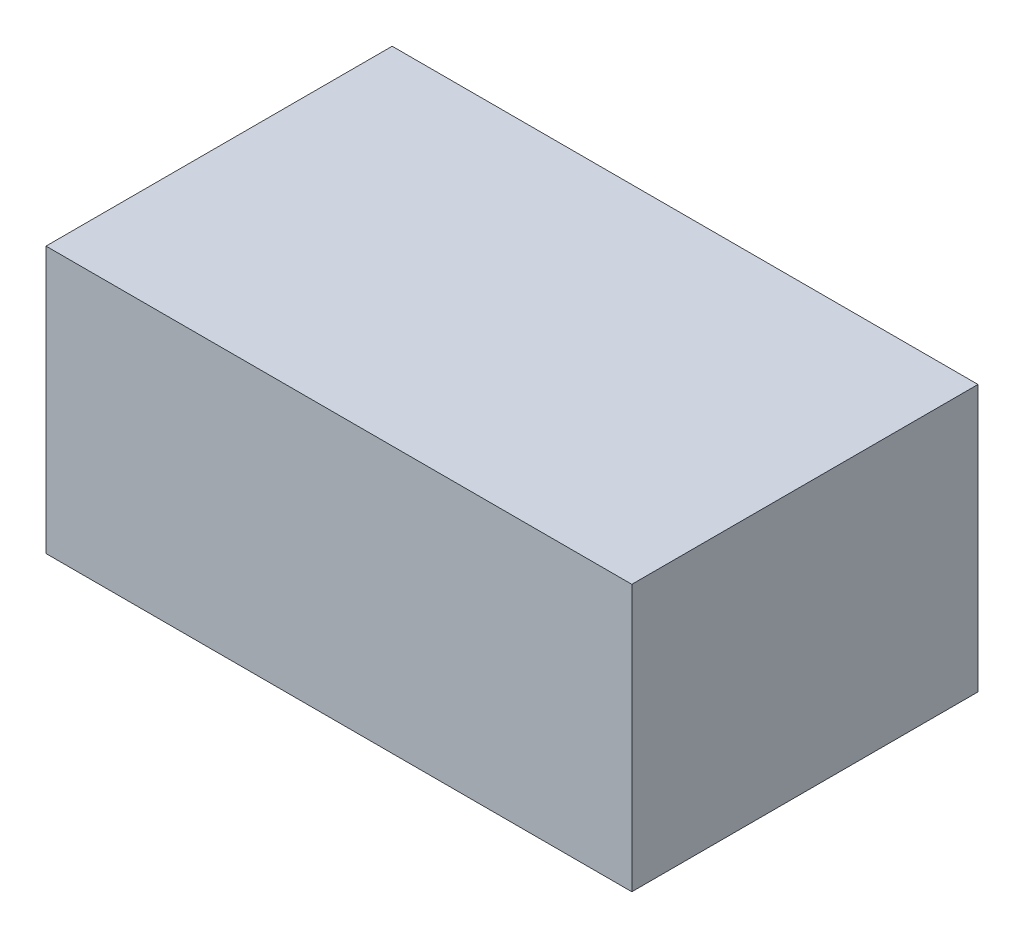
ISO-10303-21;
HEADER;
FILE_DESCRIPTION(('STEP AP214'),'2;1');
FILE_NAME('part.step','',(''),(''),'','','');
FILE_SCHEMA(('AUTOMOTIVE_DESIGN { 1 0 10303 214 1 1 1 1 }'));
ENDSEC;
DATA;
#1=APPLICATION_CONTEXT('core data for automotive mechanical design processes');
#2=APPLICATION_PROTOCOL_DEFINITION('international standard','automotive_design',2000,#1);
#3=PRODUCT_CONTEXT('',#1,'mechanical');
#4=PRODUCT('Part','Part','',(#3));
#5=PRODUCT_RELATED_PRODUCT_CATEGORY('part','',(#4));
#6=PRODUCT_DEFINITION_FORMATION('','',#4);
#7=PRODUCT_DEFINITION_CONTEXT('part definition',#1,'design');
#8=PRODUCT_DEFINITION('design','',#6,#7);
#9=PRODUCT_DEFINITION_SHAPE('','',#8);
#10=(LENGTH_UNIT() NAMED_UNIT(*) SI_UNIT(.MILLI.,.METRE.));
#11=(NAMED_UNIT(*) PLANE_ANGLE_UNIT() SI_UNIT($,.RADIAN.));
#12=(NAMED_UNIT(*) SI_UNIT($,.STERADIAN.) SOLID_ANGLE_UNIT());
#13=UNCERTAINTY_MEASURE_WITH_UNIT(LENGTH_MEASURE(1.E-05),#10,'distance_accuracy_value','');
#14=(GEOMETRIC_REPRESENTATION_CONTEXT(3) GLOBAL_UNCERTAINTY_ASSIGNED_CONTEXT((#13)) GLOBAL_UNIT_ASSIGNED_CONTEXT((#10,
#11,#12)) REPRESENTATION_CONTEXT('',''));
#15=CARTESIAN_POINT('',(0.,0.,0.));
#16=DIRECTION('',(0.,0.,1.));
#17=DIRECTION('',(1.,0.,0.));
#18=AXIS2_PLACEMENT_3D('',#15,#16,#17);
#19=CARTESIAN_POINT('',(13.97,12.7,8.255));
#20=DIRECTION('',(-1.,0.,0.));
#21=DIRECTION('',(0.,0.,1.));
#22=AXIS2_PLACEMENT_3D('',#19,#20,#21);
#23=PLANE('',#22);
#24=DIRECTION('',(0.,0.,-1.));
#25=VECTOR('',#24,1.);
#26=CARTESIAN_POINT('',(13.97,0.,8.255));
#27=LINE('',#26,#25);
#28=CARTESIAN_POINT('',(13.97,0.,8.255));
#29=VERTEX_POINT('',#28);
#30=CARTESIAN_POINT('',(13.97,0.,-8.255));
#31=VERTEX_POINT('',#30);
#32=EDGE_CURVE('E96',#29,#31,#27,.T.);
#33=ORIENTED_EDGE('',*,*,#32,.T.);
#34=DIRECTION('',(0.,-1.,0.));
#35=VECTOR('',#34,1.);
#36=CARTESIAN_POINT('',(13.97,12.7,-8.255));
#37=LINE('',#36,#35);
#38=CARTESIAN_POINT('',(13.97,12.7,-8.255));
#39=VERTEX_POINT('',#38);
#40=EDGE_CURVE('E11',#39,#31,#37,.T.);
#41=ORIENTED_EDGE('',*,*,#40,.F.);
#42=DIRECTION('',(0.,0.,-1.));
#43=VECTOR('',#42,1.);
#44=CARTESIAN_POINT('',(13.97,12.7,8.255));
#45=LINE('',#44,#43);
#46=CARTESIAN_POINT('',(13.97,12.7,8.255));
#47=VERTEX_POINT('',#46);
#48=EDGE_CURVE('E84',#47,#39,#45,.T.);
#49=ORIENTED_EDGE('',*,*,#48,.F.);
#50=DIRECTION('',(0.,-1.,0.));
#51=VECTOR('',#50,1.);
#52=CARTESIAN_POINT('',(13.97,12.7,8.255));
#53=LINE('',#52,#51);
#54=EDGE_CURVE('E92',#47,#29,#53,.T.);
#55=ORIENTED_EDGE('',*,*,#54,.T.);
#56=EDGE_LOOP('',(#33,#41,#49,#55));
#57=FACE_BOUND('',#56,.T.);
#58=ADVANCED_FACE('F33',(#57),#23,.F.);
#59=CARTESIAN_POINT('',(-13.97,12.7,-8.255));
#60=DIRECTION('',(0.,0.,1.));
#61=DIRECTION('',(1.,0.,0.));
#62=AXIS2_PLACEMENT_3D('',#59,#60,#61);
#63=PLANE('',#62);
#64=DIRECTION('',(-1.,0.,0.));
#65=VECTOR('',#64,1.);
#66=CARTESIAN_POINT('',(-13.97,0.,-8.255));
#67=LINE('',#66,#65);
#68=CARTESIAN_POINT('',(-13.97,0.,-8.255));
#69=VERTEX_POINT('',#68);
#70=EDGE_CURVE('E88',#31,#69,#67,.T.);
#71=ORIENTED_EDGE('',*,*,#70,.T.);
#72=DIRECTION('',(0.,-1.,0.));
#73=VECTOR('',#72,1.);
#74=CARTESIAN_POINT('',(-13.97,12.7,-8.255));
#75=LINE('',#74,#73);
#76=CARTESIAN_POINT('',(-13.97,12.7,-8.255));
#77=VERTEX_POINT('',#76);
#78=EDGE_CURVE('E41',#77,#69,#75,.T.);
#79=ORIENTED_EDGE('',*,*,#78,.F.);
#80=DIRECTION('',(-1.,0.,0.));
#81=VECTOR('',#80,1.);
#82=CARTESIAN_POINT('',(-13.97,12.7,-8.255));
#83=LINE('',#82,#81);
#84=EDGE_CURVE('E79',#39,#77,#83,.T.);
#85=ORIENTED_EDGE('',*,*,#84,.F.);
#86=ORIENTED_EDGE('',*,*,#40,.T.);
#87=EDGE_LOOP('',(#71,#79,#85,#86));
#88=FACE_BOUND('',#87,.T.);
#89=ADVANCED_FACE('F87',(#88),#63,.F.);
#90=CARTESIAN_POINT('',(-13.97,12.7,8.255));
#91=DIRECTION('',(1.,0.,0.));
#92=DIRECTION('',(0.,0.,-1.));
#93=AXIS2_PLACEMENT_3D('',#90,#91,#92);
#94=PLANE('',#93);
#95=DIRECTION('',(0.,0.,1.));
#96=VECTOR('',#95,1.);
#97=CARTESIAN_POINT('',(-13.97,0.,8.255));
#98=LINE('',#97,#96);
#99=CARTESIAN_POINT('',(-13.97,0.,8.255));
#100=VERTEX_POINT('',#99);
#101=EDGE_CURVE('E66',#69,#100,#98,.T.);
#102=ORIENTED_EDGE('',*,*,#101,.T.);
#103=DIRECTION('',(0.,-1.,0.));
#104=VECTOR('',#103,1.);
#105=CARTESIAN_POINT('',(-13.97,12.7,8.255));
#106=LINE('',#105,#104);
#107=CARTESIAN_POINT('',(-13.97,12.7,8.255));
#108=VERTEX_POINT('',#107);
#109=EDGE_CURVE('E89',#108,#100,#106,.T.);
#110=ORIENTED_EDGE('',*,*,#109,.F.);
#111=DIRECTION('',(0.,0.,1.));
#112=VECTOR('',#111,1.);
#113=CARTESIAN_POINT('',(-13.97,12.7,8.255));
#114=LINE('',#113,#112);
#115=EDGE_CURVE('E82',#77,#108,#114,.T.);
#116=ORIENTED_EDGE('',*,*,#115,.F.);
#117=ORIENTED_EDGE('',*,*,#78,.T.);
#118=EDGE_LOOP('',(#102,#110,#116,#117));
#119=FACE_BOUND('',#118,.T.);
#120=ADVANCED_FACE('F90',(#119),#94,.F.);
#121=CARTESIAN_POINT('',(-13.97,12.7,8.255));
#122=DIRECTION('',(0.,0.,-1.));
#123=DIRECTION('',(-1.,0.,0.));
#124=AXIS2_PLACEMENT_3D('',#121,#122,#123);
#125=PLANE('',#124);
#126=DIRECTION('',(1.,0.,0.));
#127=VECTOR('',#126,1.);
#128=CARTESIAN_POINT('',(-13.97,0.,8.255));
#129=LINE('',#128,#127);
#130=EDGE_CURVE('E72',#100,#29,#129,.T.);
#131=ORIENTED_EDGE('',*,*,#130,.T.);
#132=ORIENTED_EDGE('',*,*,#54,.F.);
#133=DIRECTION('',(1.,0.,0.));
#134=VECTOR('',#133,1.);
#135=CARTESIAN_POINT('',(-13.97,12.7,8.255));
#136=LINE('',#135,#134);
#137=EDGE_CURVE('E49',#108,#47,#136,.T.);
#138=ORIENTED_EDGE('',*,*,#137,.F.);
#139=ORIENTED_EDGE('',*,*,#109,.T.);
#140=EDGE_LOOP('',(#131,#132,#138,#139));
#141=FACE_BOUND('',#140,.T.);
#142=ADVANCED_FACE('F103',(#141),#125,.F.);
#143=CARTESIAN_POINT('',(0.,12.7,0.));
#144=DIRECTION('',(0.,-1.,0.));
#145=DIRECTION('',(0.,0.,-1.));
#146=AXIS2_PLACEMENT_3D('',#143,#144,#145);
#147=PLANE('',#146);
#148=ORIENTED_EDGE('',*,*,#48,.T.);
#149=ORIENTED_EDGE('',*,*,#84,.T.);
#150=ORIENTED_EDGE('',*,*,#115,.T.);
#151=ORIENTED_EDGE('',*,*,#137,.T.);
#152=EDGE_LOOP('',(#148,#149,#150,#151));
#153=FACE_BOUND('',#152,.T.);
#154=ADVANCED_FACE('F80',(#153),#147,.F.);
#155=CARTESIAN_POINT('',(0.,0.,0.));
#156=DIRECTION('',(0.,-1.,0.));
#157=DIRECTION('',(0.,0.,-1.));
#158=AXIS2_PLACEMENT_3D('',#155,#156,#157);
#159=PLANE('',#158);
#160=ORIENTED_EDGE('',*,*,#32,.F.);
#161=ORIENTED_EDGE('',*,*,#130,.F.);
#162=ORIENTED_EDGE('',*,*,#101,.F.);
#163=ORIENTED_EDGE('',*,*,#70,.F.);
#164=EDGE_LOOP('',(#160,#161,#162,#163));
#165=FACE_BOUND('',#164,.T.);
#166=ADVANCED_FACE('F106',(#165),#159,.T.);
#167=CLOSED_SHELL('',(#58,#89,#120,#142,#154,#166));
#168=MANIFOLD_SOLID_BREP('B2',#167);
#169=ADVANCED_BREP_SHAPE_REPRESENTATION('',(#18,#168),#14);
#170=SHAPE_DEFINITION_REPRESENTATION(#9,#169);
ENDSEC;
END-ISO-10303-21;
